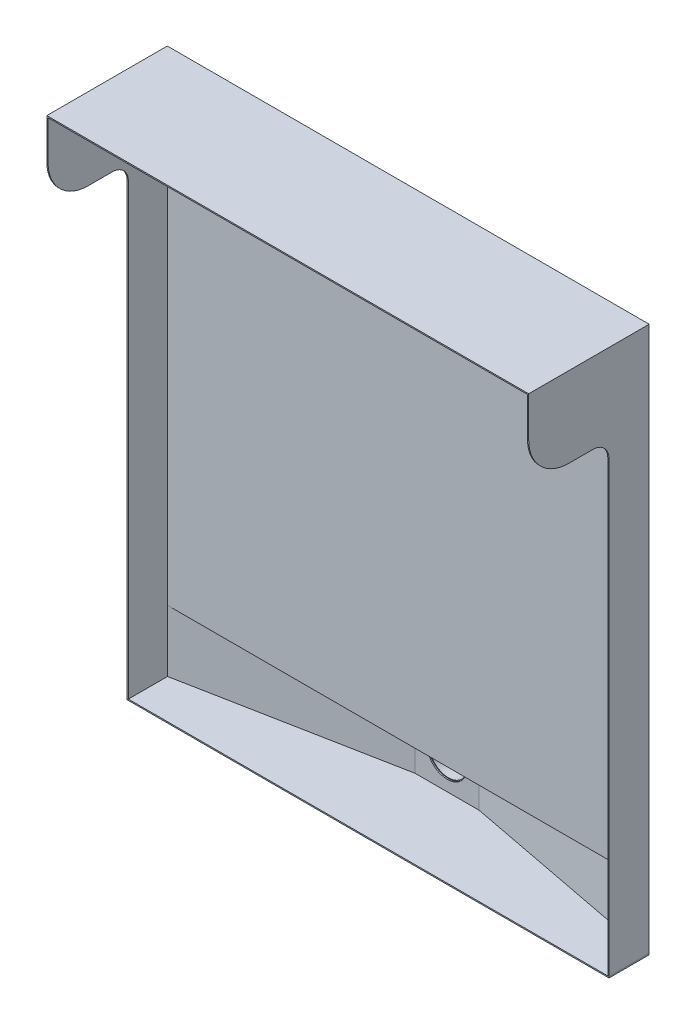
ISO-10303-21;
HEADER;
FILE_DESCRIPTION(('STEP AP214'),'2;1');
FILE_NAME('part.step','',(''),(''),'','','');
FILE_SCHEMA(('AUTOMOTIVE_DESIGN { 1 0 10303 214 1 1 1 1 }'));
ENDSEC;
DATA;
#1=APPLICATION_CONTEXT('core data for automotive mechanical design processes');
#2=APPLICATION_PROTOCOL_DEFINITION('international standard','automotive_design',2000,#1);
#3=PRODUCT_CONTEXT('',#1,'mechanical');
#4=PRODUCT('Part','Part','',(#3));
#5=PRODUCT_RELATED_PRODUCT_CATEGORY('part','',(#4));
#6=PRODUCT_DEFINITION_FORMATION('','',#4);
#7=PRODUCT_DEFINITION_CONTEXT('part definition',#1,'design');
#8=PRODUCT_DEFINITION('design','',#6,#7);
#9=PRODUCT_DEFINITION_SHAPE('','',#8);
#10=(LENGTH_UNIT() NAMED_UNIT(*) SI_UNIT(.MILLI.,.METRE.));
#11=(NAMED_UNIT(*) PLANE_ANGLE_UNIT() SI_UNIT($,.RADIAN.));
#12=(NAMED_UNIT(*) SI_UNIT($,.STERADIAN.) SOLID_ANGLE_UNIT());
#13=UNCERTAINTY_MEASURE_WITH_UNIT(LENGTH_MEASURE(1.E-05),#10,'distance_accuracy_value','');
#14=(GEOMETRIC_REPRESENTATION_CONTEXT(3) GLOBAL_UNCERTAINTY_ASSIGNED_CONTEXT((#13)) GLOBAL_UNIT_ASSIGNED_CONTEXT((#10,
#11,#12)) REPRESENTATION_CONTEXT('',''));
#15=CARTESIAN_POINT('',(0.,0.,0.));
#16=DIRECTION('',(0.,0.,1.));
#17=DIRECTION('',(1.,0.,0.));
#18=AXIS2_PLACEMENT_3D('',#15,#16,#17);
#19=CARTESIAN_POINT('',(0.,-300.,-75.));
#20=DIRECTION('',(0.,0.,-1.));
#21=DIRECTION('',(-1.,0.,0.));
#22=AXIS2_PLACEMENT_3D('',#19,#20,#21);
#23=PLANE('',#22);
#24=CARTESIAN_POINT('',(0.,-300.,-75.));
#25=DIRECTION('',(0.,0.,-1.));
#26=DIRECTION('',(-1.,0.,0.));
#27=AXIS2_PLACEMENT_3D('',#24,#25,#26);
#28=CIRCLE('',#27,25.);
#29=CARTESIAN_POINT('',(-25.,-300.,-75.));
#30=VERTEX_POINT('',#29);
#31=EDGE_CURVE('E12',#30,#30,#28,.T.);
#32=ORIENTED_EDGE('',*,*,#31,.T.);
#33=EDGE_LOOP('',(#32));
#34=FACE_BOUND('',#33,.T.);
#35=CARTESIAN_POINT('',(0.,-300.,-75.));
#36=DIRECTION('',(0.,0.,-1.));
#37=DIRECTION('',(-1.,0.,0.));
#38=AXIS2_PLACEMENT_3D('',#35,#36,#37);
#39=CIRCLE('',#38,24.);
#40=CARTESIAN_POINT('',(-24.,-300.,-75.));
#41=VERTEX_POINT('',#40);
#42=EDGE_CURVE('E73',#41,#41,#39,.T.);
#43=ORIENTED_EDGE('',*,*,#42,.F.);
#44=EDGE_LOOP('',(#43));
#45=FACE_BOUND('',#44,.T.);
#46=ADVANCED_FACE('F59',(#34,#45),#23,.T.);
#47=CARTESIAN_POINT('',(0.,-300.,-50.));
#48=DIRECTION('',(0.,0.,-1.));
#49=DIRECTION('',(-1.,0.,0.));
#50=AXIS2_PLACEMENT_3D('',#47,#48,#49);
#51=PLANE('',#50);
#52=CARTESIAN_POINT('',(0.,-300.,-50.));
#53=DIRECTION('',(0.,0.,-1.));
#54=DIRECTION('',(-1.,0.,0.));
#55=AXIS2_PLACEMENT_3D('',#52,#53,#54);
#56=CIRCLE('',#55,25.);
#57=CARTESIAN_POINT('',(-25.,-300.,-50.));
#58=VERTEX_POINT('',#57);
#59=EDGE_CURVE('E63',#58,#58,#56,.T.);
#60=ORIENTED_EDGE('',*,*,#59,.F.);
#61=EDGE_LOOP('',(#60));
#62=FACE_BOUND('',#61,.T.);
#63=CARTESIAN_POINT('',(0.,-300.,-50.));
#64=DIRECTION('',(0.,0.,-1.));
#65=DIRECTION('',(-1.,0.,0.));
#66=AXIS2_PLACEMENT_3D('',#63,#64,#65);
#67=CIRCLE('',#66,24.);
#68=CARTESIAN_POINT('',(-24.,-300.,-50.));
#69=VERTEX_POINT('',#68);
#70=EDGE_CURVE('E75',#69,#69,#67,.T.);
#71=ORIENTED_EDGE('',*,*,#70,.T.);
#72=EDGE_LOOP('',(#71));
#73=FACE_BOUND('',#72,.T.);
#74=ADVANCED_FACE('F86',(#62,#73),#51,.F.);
#75=CARTESIAN_POINT('',(0.,-300.,-75.));
#76=DIRECTION('',(0.,0.,1.));
#77=DIRECTION('',(1.,0.,0.));
#78=AXIS2_PLACEMENT_3D('',#75,#76,#77);
#79=CYLINDRICAL_SURFACE('',#78,25.);
#80=ORIENTED_EDGE('',*,*,#31,.F.);
#81=EDGE_LOOP('',(#80));
#82=FACE_BOUND('',#81,.T.);
#83=ORIENTED_EDGE('',*,*,#59,.T.);
#84=EDGE_LOOP('',(#83));
#85=FACE_BOUND('',#84,.T.);
#86=ADVANCED_FACE('F61',(#82,#85),#79,.T.);
#87=CARTESIAN_POINT('',(0.,-300.,-75.));
#88=DIRECTION('',(0.,0.,1.));
#89=DIRECTION('',(1.,0.,0.));
#90=AXIS2_PLACEMENT_3D('',#87,#88,#89);
#91=CYLINDRICAL_SURFACE('',#90,24.);
#92=ORIENTED_EDGE('',*,*,#42,.T.);
#93=EDGE_LOOP('',(#92));
#94=FACE_BOUND('',#93,.T.);
#95=ORIENTED_EDGE('',*,*,#70,.F.);
#96=EDGE_LOOP('',(#95));
#97=FACE_BOUND('',#96,.T.);
#98=ADVANCED_FACE('F82',(#94,#97),#91,.F.);
#99=CLOSED_SHELL('',(#46,#74,#86,#98));
#100=MANIFOLD_SOLID_BREP('B2',#99);
#101=CARTESIAN_POINT('',(-298.5,-338.5,150.));
#102=DIRECTION('',(0.,1.,0.));
#103=DIRECTION('',(-1.,0.,0.));
#104=AXIS2_PLACEMENT_3D('',#101,#102,#103);
#105=PLANE('',#104);
#106=DIRECTION('',(-1.,0.,0.));
#107=VECTOR('',#106,1.);
#108=CARTESIAN_POINT('',(-298.5,-338.5,50.0000000000001));
#109=LINE('',#108,#107);
#110=CARTESIAN_POINT('',(300.,-338.5,50.0000000000001));
#111=VERTEX_POINT('',#110);
#112=CARTESIAN_POINT('',(-300.,-338.5,50.0000000000001));
#113=VERTEX_POINT('',#112);
#114=EDGE_CURVE('E191',#111,#113,#109,.T.);
#115=ORIENTED_EDGE('',*,*,#114,.F.);
#116=DIRECTION('',(0.,0.,-1.));
#117=VECTOR('',#116,1.);
#118=CARTESIAN_POINT('',(300.,-338.5,150.));
#119=LINE('',#118,#117);
#120=CARTESIAN_POINT('',(300.,-338.5,0.));
#121=VERTEX_POINT('',#120);
#122=EDGE_CURVE('E199',#111,#121,#119,.T.);
#123=ORIENTED_EDGE('',*,*,#122,.T.);
#124=DIRECTION('',(0.982006446980647,0.,0.188847393650125));
#125=VECTOR('',#124,1.);
#126=CARTESIAN_POINT('',(40.0000000000001,-338.5,-50.));
#127=LINE('',#126,#125);
#128=CARTESIAN_POINT('',(40.0000000000001,-338.5,-50.));
#129=VERTEX_POINT('',#128);
#130=EDGE_CURVE('E251',#129,#121,#127,.T.);
#131=ORIENTED_EDGE('',*,*,#130,.F.);
#132=DIRECTION('',(1.,0.,0.));
#133=VECTOR('',#132,1.);
#134=CARTESIAN_POINT('',(40.0000000000001,-338.5,-50.));
#135=LINE('',#134,#133);
#136=CARTESIAN_POINT('',(-39.9999999999999,-338.5,-50.));
#137=VERTEX_POINT('',#136);
#138=EDGE_CURVE('E214',#137,#129,#135,.T.);
#139=ORIENTED_EDGE('',*,*,#138,.F.);
#140=DIRECTION('',(0.982006446980647,0.,-0.188847393650125));
#141=VECTOR('',#140,1.);
#142=CARTESIAN_POINT('',(-300.,-338.5,0.));
#143=LINE('',#142,#141);
#144=CARTESIAN_POINT('',(-300.,-338.5,0.));
#145=VERTEX_POINT('',#144);
#146=EDGE_CURVE('E212',#145,#137,#143,.T.);
#147=ORIENTED_EDGE('',*,*,#146,.F.);
#148=DIRECTION('',(0.,0.,1.));
#149=VECTOR('',#148,1.);
#150=CARTESIAN_POINT('',(-300.,-338.5,150.));
#151=LINE('',#150,#149);
#152=EDGE_CURVE('E206',#145,#113,#151,.T.);
#153=ORIENTED_EDGE('',*,*,#152,.T.);
#154=EDGE_LOOP('',(#115,#123,#131,#139,#147,#153));
#155=FACE_BOUND('',#154,.T.);
#156=ADVANCED_FACE('F138',(#155),#105,.T.);
#157=CARTESIAN_POINT('',(-300.,340.,150.));
#158=DIRECTION('',(1.,0.,0.));
#159=DIRECTION('',(0.,1.,0.));
#160=AXIS2_PLACEMENT_3D('',#157,#158,#159);
#161=PLANE('',#160);
#162=DIRECTION('',(0.,0.,-1.));
#163=VECTOR('',#162,1.);
#164=CARTESIAN_POINT('',(-300.,-340.,150.));
#165=LINE('',#164,#163);
#166=CARTESIAN_POINT('',(-300.,-340.,50.));
#167=VERTEX_POINT('',#166);
#168=CARTESIAN_POINT('',(-300.,-340.,0.));
#169=VERTEX_POINT('',#168);
#170=EDGE_CURVE('E208',#167,#169,#165,.T.);
#171=ORIENTED_EDGE('',*,*,#170,.F.);
#172=DIRECTION('',(0.,-1.,0.));
#173=VECTOR('',#172,1.);
#174=CARTESIAN_POINT('',(-300.,240.,50.));
#175=LINE('',#174,#173);
#176=EDGE_CURVE('E154',#113,#167,#175,.T.);
#177=ORIENTED_EDGE('',*,*,#176,.F.);
#178=ORIENTED_EDGE('',*,*,#152,.F.);
#179=DIRECTION('',(0.,-1.,0.));
#180=VECTOR('',#179,1.);
#181=CARTESIAN_POINT('',(-300.,-260.,0.));
#182=LINE('',#181,#180);
#183=EDGE_CURVE('E231',#145,#169,#182,.T.);
#184=ORIENTED_EDGE('',*,*,#183,.T.);
#185=EDGE_LOOP('',(#171,#177,#178,#184));
#186=FACE_BOUND('',#185,.T.);
#187=ADVANCED_FACE('F204',(#186),#161,.F.);
#188=CARTESIAN_POINT('',(300.,340.,150.));
#189=DIRECTION('',(-1.,0.,0.));
#190=DIRECTION('',(0.,-1.,0.));
#191=AXIS2_PLACEMENT_3D('',#188,#189,#190);
#192=PLANE('',#191);
#193=ORIENTED_EDGE('',*,*,#122,.F.);
#194=DIRECTION('',(0.,-1.,0.));
#195=VECTOR('',#194,1.);
#196=CARTESIAN_POINT('',(300.,240.,50.));
#197=LINE('',#196,#195);
#198=CARTESIAN_POINT('',(300.,-340.,50.0000000000001));
#199=VERTEX_POINT('',#198);
#200=EDGE_CURVE('E194',#111,#199,#197,.T.);
#201=ORIENTED_EDGE('',*,*,#200,.T.);
#202=DIRECTION('',(0.,0.,-1.));
#203=VECTOR('',#202,1.);
#204=CARTESIAN_POINT('',(300.,-340.,150.));
#205=LINE('',#204,#203);
#206=CARTESIAN_POINT('',(300.,-340.,0.));
#207=VERTEX_POINT('',#206);
#208=EDGE_CURVE('E228',#199,#207,#205,.T.);
#209=ORIENTED_EDGE('',*,*,#208,.T.);
#210=DIRECTION('',(0.,1.,0.));
#211=VECTOR('',#210,1.);
#212=CARTESIAN_POINT('',(300.,340.,0.));
#213=LINE('',#212,#211);
#214=EDGE_CURVE('E223',#207,#121,#213,.T.);
#215=ORIENTED_EDGE('',*,*,#214,.T.);
#216=EDGE_LOOP('',(#193,#201,#209,#215));
#217=FACE_BOUND('',#216,.T.);
#218=ADVANCED_FACE('F264',(#217),#192,.F.);
#219=CARTESIAN_POINT('',(40.0000000000001,-260.,-50.));
#220=DIRECTION('',(0.,0.,-1.));
#221=DIRECTION('',(-1.,0.,0.));
#222=AXIS2_PLACEMENT_3D('',#219,#220,#221);
#223=PLANE('',#222);
#224=DIRECTION('',(0.,-1.,0.));
#225=VECTOR('',#224,1.);
#226=CARTESIAN_POINT('',(-39.9999999999999,-260.,-50.));
#227=LINE('',#226,#225);
#228=CARTESIAN_POINT('',(-39.9999999999999,-340.,-50.));
#229=VERTEX_POINT('',#228);
#230=EDGE_CURVE('E227',#137,#229,#227,.T.);
#231=ORIENTED_EDGE('',*,*,#230,.F.);
#232=ORIENTED_EDGE('',*,*,#138,.T.);
#233=DIRECTION('',(0.,-1.,0.));
#234=VECTOR('',#233,1.);
#235=CARTESIAN_POINT('',(40.0000000000001,-260.,-50.));
#236=LINE('',#235,#234);
#237=CARTESIAN_POINT('',(40.0000000000001,-340.,-50.));
#238=VERTEX_POINT('',#237);
#239=EDGE_CURVE('E161',#129,#238,#236,.T.);
#240=ORIENTED_EDGE('',*,*,#239,.T.);
#241=DIRECTION('',(1.,0.,0.));
#242=VECTOR('',#241,1.);
#243=CARTESIAN_POINT('',(40.0000000000001,-340.,-50.));
#244=LINE('',#243,#242);
#245=EDGE_CURVE('E147',#229,#238,#244,.T.);
#246=ORIENTED_EDGE('',*,*,#245,.F.);
#247=EDGE_LOOP('',(#231,#232,#240,#246));
#248=FACE_BOUND('',#247,.T.);
#249=ADVANCED_FACE('F257',(#248),#223,.T.);
#250=CARTESIAN_POINT('',(-300.,-260.,0.));
#251=DIRECTION('',(-0.188847393650125,0.,-0.982006446980647));
#252=DIRECTION('',(-0.982006446980647,0.,0.188847393650125));
#253=AXIS2_PLACEMENT_3D('',#250,#251,#252);
#254=PLANE('',#253);
#255=ORIENTED_EDGE('',*,*,#183,.F.);
#256=ORIENTED_EDGE('',*,*,#146,.T.);
#257=ORIENTED_EDGE('',*,*,#230,.T.);
#258=DIRECTION('',(0.982006446980647,0.,-0.188847393650125));
#259=VECTOR('',#258,1.);
#260=CARTESIAN_POINT('',(-300.,-340.,0.));
#261=LINE('',#260,#259);
#262=EDGE_CURVE('E233',#169,#229,#261,.T.);
#263=ORIENTED_EDGE('',*,*,#262,.F.);
#264=EDGE_LOOP('',(#255,#256,#257,#263));
#265=FACE_BOUND('',#264,.T.);
#266=ADVANCED_FACE('F140',(#265),#254,.T.);
#267=CARTESIAN_POINT('',(40.0000000000001,-260.,-50.));
#268=DIRECTION('',(0.188847393650125,0.,-0.982006446980647));
#269=DIRECTION('',(-0.982006446980647,0.,-0.188847393650125));
#270=AXIS2_PLACEMENT_3D('',#267,#268,#269);
#271=PLANE('',#270);
#272=ORIENTED_EDGE('',*,*,#239,.F.);
#273=ORIENTED_EDGE('',*,*,#130,.T.);
#274=ORIENTED_EDGE('',*,*,#214,.F.);
#275=DIRECTION('',(0.982006446980647,0.,0.188847393650125));
#276=VECTOR('',#275,1.);
#277=CARTESIAN_POINT('',(40.0000000000001,-340.,-50.));
#278=LINE('',#277,#276);
#279=EDGE_CURVE('E237',#238,#207,#278,.T.);
#280=ORIENTED_EDGE('',*,*,#279,.F.);
#281=EDGE_LOOP('',(#272,#273,#274,#280));
#282=FACE_BOUND('',#281,.T.);
#283=ADVANCED_FACE('F262',(#282),#271,.T.);
#284=CARTESIAN_POINT('',(300.,-340.,150.));
#285=DIRECTION('',(0.,1.,0.));
#286=DIRECTION('',(-1.,0.,0.));
#287=AXIS2_PLACEMENT_3D('',#284,#285,#286);
#288=PLANE('',#287);
#289=ORIENTED_EDGE('',*,*,#208,.F.);
#290=DIRECTION('',(-1.,0.,0.));
#291=VECTOR('',#290,1.);
#292=CARTESIAN_POINT('',(300.,-340.,50.0000000000001));
#293=LINE('',#292,#291);
#294=EDGE_CURVE('E57',#199,#167,#293,.T.);
#295=ORIENTED_EDGE('',*,*,#294,.T.);
#296=ORIENTED_EDGE('',*,*,#170,.T.);
#297=ORIENTED_EDGE('',*,*,#262,.T.);
#298=ORIENTED_EDGE('',*,*,#245,.T.);
#299=ORIENTED_EDGE('',*,*,#279,.T.);
#300=EDGE_LOOP('',(#289,#295,#296,#297,#298,#299));
#301=FACE_BOUND('',#300,.T.);
#302=ADVANCED_FACE('F259',(#301),#288,.F.);
#303=CARTESIAN_POINT('',(300.,240.,50.));
#304=DIRECTION('',(0.,0.,-1.));
#305=DIRECTION('',(0.,1.,0.));
#306=AXIS2_PLACEMENT_3D('',#303,#304,#305);
#307=PLANE('',#306);
#308=ORIENTED_EDGE('',*,*,#114,.T.);
#309=ORIENTED_EDGE('',*,*,#176,.T.);
#310=ORIENTED_EDGE('',*,*,#294,.F.);
#311=ORIENTED_EDGE('',*,*,#200,.F.);
#312=EDGE_LOOP('',(#308,#309,#310,#311));
#313=FACE_BOUND('',#312,.T.);
#314=ADVANCED_FACE('F192',(#313),#307,.F.);
#315=CLOSED_SHELL('',(#156,#187,#218,#249,#266,#283,#302,#314));
#316=MANIFOLD_SOLID_BREP('B7',#315);
#317=CARTESIAN_POINT('',(0.,0.,150.));
#318=DIRECTION('',(0.,0.,-1.));
#319=DIRECTION('',(-1.,0.,0.));
#320=AXIS2_PLACEMENT_3D('',#317,#318,#319);
#321=PLANE('',#320);
#322=DIRECTION('',(0.,1.,0.));
#323=VECTOR('',#322,1.);
#324=CARTESIAN_POINT('',(298.5,0.,150.));
#325=LINE('',#324,#323);
#326=CARTESIAN_POINT('',(298.5,290.,150.));
#327=VERTEX_POINT('',#326);
#328=CARTESIAN_POINT('',(298.5,338.5,150.));
#329=VERTEX_POINT('',#328);
#330=EDGE_CURVE('E718',#327,#329,#325,.T.);
#331=ORIENTED_EDGE('',*,*,#330,.F.);
#332=DIRECTION('',(-1.,0.,0.));
#333=VECTOR('',#332,1.);
#334=CARTESIAN_POINT('',(300.,290.,150.));
#335=LINE('',#334,#333);
#336=CARTESIAN_POINT('',(300.,290.,150.));
#337=VERTEX_POINT('',#336);
#338=EDGE_CURVE('E591',#327,#337,#335,.F.);
#339=ORIENTED_EDGE('',*,*,#338,.T.);
#340=DIRECTION('',(0.,1.,0.));
#341=VECTOR('',#340,1.);
#342=CARTESIAN_POINT('',(300.,340.,150.));
#343=LINE('',#342,#341);
#344=CARTESIAN_POINT('',(300.,340.,150.));
#345=VERTEX_POINT('',#344);
#346=EDGE_CURVE('E613',#337,#345,#343,.T.);
#347=ORIENTED_EDGE('',*,*,#346,.T.);
#348=DIRECTION('',(-1.,0.,0.));
#349=VECTOR('',#348,1.);
#350=CARTESIAN_POINT('',(300.,340.,150.));
#351=LINE('',#350,#349);
#352=CARTESIAN_POINT('',(-300.,340.,150.));
#353=VERTEX_POINT('',#352);
#354=EDGE_CURVE('E610',#345,#353,#351,.T.);
#355=ORIENTED_EDGE('',*,*,#354,.T.);
#356=DIRECTION('',(0.,-1.,0.));
#357=VECTOR('',#356,1.);
#358=CARTESIAN_POINT('',(-300.,340.,150.));
#359=LINE('',#358,#357);
#360=CARTESIAN_POINT('',(-300.,290.,150.));
#361=VERTEX_POINT('',#360);
#362=EDGE_CURVE('E604',#353,#361,#359,.T.);
#363=ORIENTED_EDGE('',*,*,#362,.T.);
#364=DIRECTION('',(-1.,0.,0.));
#365=VECTOR('',#364,1.);
#366=CARTESIAN_POINT('',(-298.5,290.,150.));
#367=LINE('',#366,#365);
#368=CARTESIAN_POINT('',(-298.5,290.,150.));
#369=VERTEX_POINT('',#368);
#370=EDGE_CURVE('E588',#361,#369,#367,.F.);
#371=ORIENTED_EDGE('',*,*,#370,.T.);
#372=DIRECTION('',(0.,-1.,0.));
#373=VECTOR('',#372,1.);
#374=CARTESIAN_POINT('',(-298.5,0.,150.));
#375=LINE('',#374,#373);
#376=CARTESIAN_POINT('',(-298.5,338.5,150.));
#377=VERTEX_POINT('',#376);
#378=EDGE_CURVE('E659',#377,#369,#375,.T.);
#379=ORIENTED_EDGE('',*,*,#378,.F.);
#380=DIRECTION('',(-1.,0.,0.));
#381=VECTOR('',#380,1.);
#382=CARTESIAN_POINT('',(0.,338.5,150.));
#383=LINE('',#382,#381);
#384=EDGE_CURVE('E673',#329,#377,#383,.T.);
#385=ORIENTED_EDGE('',*,*,#384,.F.);
#386=EDGE_LOOP('',(#331,#339,#347,#355,#363,#371,#379,#385));
#387=FACE_BOUND('',#386,.T.);
#388=ADVANCED_FACE('F352',(#387),#321,.F.);
#389=CARTESIAN_POINT('',(-298.5,-338.5,150.));
#390=DIRECTION('',(0.,1.,0.));
#391=DIRECTION('',(-1.,0.,0.));
#392=AXIS2_PLACEMENT_3D('',#389,#390,#391);
#393=PLANE('',#392);
#394=DIRECTION('',(0.,0.,-1.));
#395=VECTOR('',#394,1.);
#396=CARTESIAN_POINT('',(300.,-338.5,150.));
#397=LINE('',#396,#395);
#398=CARTESIAN_POINT('',(300.,-338.5,50.0000000000001));
#399=VERTEX_POINT('',#398);
#400=CARTESIAN_POINT('',(300.,-338.5,0.));
#401=VERTEX_POINT('',#400);
#402=EDGE_CURVE('E543',#399,#401,#397,.T.);
#403=ORIENTED_EDGE('',*,*,#402,.F.);
#404=DIRECTION('',(-1.,0.,0.));
#405=VECTOR('',#404,1.);
#406=CARTESIAN_POINT('',(-298.5,-338.5,50.0000000000001));
#407=LINE('',#406,#405);
#408=CARTESIAN_POINT('',(298.5,-338.5,50.0000000000001));
#409=VERTEX_POINT('',#408);
#410=EDGE_CURVE('E535',#399,#409,#407,.T.);
#411=ORIENTED_EDGE('',*,*,#410,.T.);
#412=DIRECTION('',(0.,0.,-1.));
#413=VECTOR('',#412,1.);
#414=CARTESIAN_POINT('',(298.5,-338.5,150.));
#415=LINE('',#414,#413);
#416=CARTESIAN_POINT('',(298.5,-338.5,1.2390233417162));
#417=VERTEX_POINT('',#416);
#418=EDGE_CURVE('E558',#409,#417,#415,.T.);
#419=ORIENTED_EDGE('',*,*,#418,.T.);
#420=DIRECTION('',(0.982006446980647,0.,0.188847393650125));
#421=VECTOR('',#420,1.);
#422=CARTESIAN_POINT('',(39.7167289095249,-338.5,-48.526990329529));
#423=LINE('',#422,#421);
#424=CARTESIAN_POINT('',(39.8570786230759,-338.5,-48.5));
#425=VERTEX_POINT('',#424);
#426=EDGE_CURVE('E678',#425,#417,#423,.T.);
#427=ORIENTED_EDGE('',*,*,#426,.F.);
#428=DIRECTION('',(1.,0.,0.));
#429=VECTOR('',#428,1.);
#430=CARTESIAN_POINT('',(40.0000000000001,-338.5,-48.5));
#431=LINE('',#430,#429);
#432=CARTESIAN_POINT('',(-39.8570786230757,-338.5,-48.5));
#433=VERTEX_POINT('',#432);
#434=EDGE_CURVE('E679',#433,#425,#431,.T.);
#435=ORIENTED_EDGE('',*,*,#434,.F.);
#436=DIRECTION('',(0.982006446980647,0.,-0.188847393650125));
#437=VECTOR('',#436,1.);
#438=CARTESIAN_POINT('',(-299.716728909525,-338.5,1.47300967047097));
#439=LINE('',#438,#437);
#440=CARTESIAN_POINT('',(-298.5,-338.5,1.23902334171621));
#441=VERTEX_POINT('',#440);
#442=EDGE_CURVE('E674',#441,#433,#439,.T.);
#443=ORIENTED_EDGE('',*,*,#442,.F.);
#444=DIRECTION('',(0.,0.,-1.));
#445=VECTOR('',#444,1.);
#446=CARTESIAN_POINT('',(-298.5,-338.5,150.));
#447=LINE('',#446,#445);
#448=CARTESIAN_POINT('',(-298.5,-338.5,50.0000000000001));
#449=VERTEX_POINT('',#448);
#450=EDGE_CURVE('E530',#449,#441,#447,.T.);
#451=ORIENTED_EDGE('',*,*,#450,.F.);
#452=CARTESIAN_POINT('',(-300.,-338.5,50.0000000000001));
#453=VERTEX_POINT('',#452);
#454=EDGE_CURVE('E511',#449,#453,#407,.T.);
#455=ORIENTED_EDGE('',*,*,#454,.T.);
#456=DIRECTION('',(0.,0.,1.));
#457=VECTOR('',#456,1.);
#458=CARTESIAN_POINT('',(-300.,-338.5,150.));
#459=LINE('',#458,#457);
#460=CARTESIAN_POINT('',(-300.,-338.5,0.));
#461=VERTEX_POINT('',#460);
#462=EDGE_CURVE('E527',#461,#453,#459,.T.);
#463=ORIENTED_EDGE('',*,*,#462,.F.);
#464=DIRECTION('',(0.982006446980647,0.,-0.188847393650125));
#465=VECTOR('',#464,1.);
#466=CARTESIAN_POINT('',(-300.,-338.5,0.));
#467=LINE('',#466,#465);
#468=CARTESIAN_POINT('',(-39.9999999999999,-338.5,-50.));
#469=VERTEX_POINT('',#468);
#470=EDGE_CURVE('E548',#461,#469,#467,.T.);
#471=ORIENTED_EDGE('',*,*,#470,.T.);
#472=DIRECTION('',(1.,0.,0.));
#473=VECTOR('',#472,1.);
#474=CARTESIAN_POINT('',(40.0000000000001,-338.5,-50.));
#475=LINE('',#474,#473);
#476=CARTESIAN_POINT('',(40.0000000000001,-338.5,-50.));
#477=VERTEX_POINT('',#476);
#478=EDGE_CURVE('E542',#469,#477,#475,.T.);
#479=ORIENTED_EDGE('',*,*,#478,.T.);
#480=DIRECTION('',(0.982006446980647,0.,0.188847393650125));
#481=VECTOR('',#480,1.);
#482=CARTESIAN_POINT('',(40.0000000000001,-338.5,-50.));
#483=LINE('',#482,#481);
#484=EDGE_CURVE('E687',#477,#401,#483,.T.);
#485=ORIENTED_EDGE('',*,*,#484,.T.);
#486=EDGE_LOOP('',(#403,#411,#419,#427,#435,#443,#451,#455,#463,#471,#479,#485));
#487=FACE_BOUND('',#486,.T.);
#488=ADVANCED_FACE('F525',(#487),#393,.F.);
#489=CARTESIAN_POINT('',(300.,340.,150.));
#490=DIRECTION('',(0.,-1.,0.));
#491=DIRECTION('',(1.,0.,0.));
#492=AXIS2_PLACEMENT_3D('',#489,#490,#491);
#493=PLANE('',#492);
#494=DIRECTION('',(-1.,0.,0.));
#495=VECTOR('',#494,1.);
#496=CARTESIAN_POINT('',(300.,340.,0.));
#497=LINE('',#496,#495);
#498=CARTESIAN_POINT('',(300.,340.,0.));
#499=VERTEX_POINT('',#498);
#500=CARTESIAN_POINT('',(-300.,340.,0.));
#501=VERTEX_POINT('',#500);
#502=EDGE_CURVE('E614',#499,#501,#497,.T.);
#503=ORIENTED_EDGE('',*,*,#502,.T.);
#504=DIRECTION('',(0.,0.,-1.));
#505=VECTOR('',#504,1.);
#506=CARTESIAN_POINT('',(-300.,340.,150.));
#507=LINE('',#506,#505);
#508=EDGE_CURVE('E751',#353,#501,#507,.T.);
#509=ORIENTED_EDGE('',*,*,#508,.F.);
#510=ORIENTED_EDGE('',*,*,#354,.F.);
#511=DIRECTION('',(0.,0.,-1.));
#512=VECTOR('',#511,1.);
#513=CARTESIAN_POINT('',(300.,340.,150.));
#514=LINE('',#513,#512);
#515=EDGE_CURVE('E551',#345,#499,#514,.T.);
#516=ORIENTED_EDGE('',*,*,#515,.T.);
#517=EDGE_LOOP('',(#503,#509,#510,#516));
#518=FACE_BOUND('',#517,.T.);
#519=ADVANCED_FACE('F859',(#518),#493,.F.);
#520=CARTESIAN_POINT('',(0.,0.,0.));
#521=DIRECTION('',(0.,0.,-1.));
#522=DIRECTION('',(-1.,0.,0.));
#523=AXIS2_PLACEMENT_3D('',#520,#521,#522);
#524=PLANE('',#523);
#525=DIRECTION('',(0.,1.,0.));
#526=VECTOR('',#525,1.);
#527=CARTESIAN_POINT('',(300.,340.,0.));
#528=LINE('',#527,#526);
#529=CARTESIAN_POINT('',(300.,-260.,0.));
#530=VERTEX_POINT('',#529);
#531=EDGE_CURVE('E754',#530,#499,#528,.T.);
#532=ORIENTED_EDGE('',*,*,#531,.F.);
#533=DIRECTION('',(-1.,0.,0.));
#534=VECTOR('',#533,1.);
#535=CARTESIAN_POINT('',(300.,-260.,0.));
#536=LINE('',#535,#534);
#537=CARTESIAN_POINT('',(-300.,-260.,0.));
#538=VERTEX_POINT('',#537);
#539=EDGE_CURVE('E730',#530,#538,#536,.T.);
#540=ORIENTED_EDGE('',*,*,#539,.T.);
#541=DIRECTION('',(0.,-1.,0.));
#542=VECTOR('',#541,1.);
#543=CARTESIAN_POINT('',(-300.,340.,0.));
#544=LINE('',#543,#542);
#545=EDGE_CURVE('E743',#501,#538,#544,.T.);
#546=ORIENTED_EDGE('',*,*,#545,.F.);
#547=ORIENTED_EDGE('',*,*,#502,.F.);
#548=EDGE_LOOP('',(#532,#540,#546,#547));
#549=FACE_BOUND('',#548,.T.);
#550=ADVANCED_FACE('F787',(#549),#524,.T.);
#551=CARTESIAN_POINT('',(0.,0.,1.5));
#552=DIRECTION('',(0.,0.,-1.));
#553=DIRECTION('',(-1.,0.,0.));
#554=AXIS2_PLACEMENT_3D('',#551,#552,#553);
#555=PLANE('',#554);
#556=DIRECTION('',(0.,1.,0.));
#557=VECTOR('',#556,1.);
#558=CARTESIAN_POINT('',(298.5,0.,1.5));
#559=LINE('',#558,#557);
#560=CARTESIAN_POINT('',(298.5,-261.5,1.5));
#561=VERTEX_POINT('',#560);
#562=CARTESIAN_POINT('',(298.5,338.5,1.5));
#563=VERTEX_POINT('',#562);
#564=EDGE_CURVE('E641',#561,#563,#559,.T.);
#565=ORIENTED_EDGE('',*,*,#564,.T.);
#566=DIRECTION('',(-1.,0.,0.));
#567=VECTOR('',#566,1.);
#568=CARTESIAN_POINT('',(0.,338.5,1.5));
#569=LINE('',#568,#567);
#570=CARTESIAN_POINT('',(-298.5,338.5,1.5));
#571=VERTEX_POINT('',#570);
#572=EDGE_CURVE('E656',#563,#571,#569,.T.);
#573=ORIENTED_EDGE('',*,*,#572,.T.);
#574=DIRECTION('',(0.,-1.,0.));
#575=VECTOR('',#574,1.);
#576=CARTESIAN_POINT('',(-298.5,0.,1.5));
#577=LINE('',#576,#575);
#578=CARTESIAN_POINT('',(-298.5,-261.5,1.5));
#579=VERTEX_POINT('',#578);
#580=EDGE_CURVE('E645',#571,#579,#577,.T.);
#581=ORIENTED_EDGE('',*,*,#580,.T.);
#582=DIRECTION('',(-1.,0.,0.));
#583=VECTOR('',#582,1.);
#584=CARTESIAN_POINT('',(0.,-261.5,1.5));
#585=LINE('',#584,#583);
#586=EDGE_CURVE('E646',#561,#579,#585,.T.);
#587=ORIENTED_EDGE('',*,*,#586,.F.);
#588=EDGE_LOOP('',(#565,#573,#581,#587));
#589=FACE_BOUND('',#588,.T.);
#590=ADVANCED_FACE('F825',(#589),#555,.F.);
#591=CARTESIAN_POINT('',(300.,338.5,150.));
#592=DIRECTION('',(0.,-1.,0.));
#593=DIRECTION('',(1.,0.,0.));
#594=AXIS2_PLACEMENT_3D('',#591,#592,#593);
#595=PLANE('',#594);
#596=ORIENTED_EDGE('',*,*,#572,.F.);
#597=DIRECTION('',(0.,0.,-1.));
#598=VECTOR('',#597,1.);
#599=CARTESIAN_POINT('',(298.5,338.5,150.));
#600=LINE('',#599,#598);
#601=EDGE_CURVE('E668',#329,#563,#600,.T.);
#602=ORIENTED_EDGE('',*,*,#601,.F.);
#603=ORIENTED_EDGE('',*,*,#384,.T.);
#604=DIRECTION('',(0.,0.,-1.));
#605=VECTOR('',#604,1.);
#606=CARTESIAN_POINT('',(-298.5,338.5,150.));
#607=LINE('',#606,#605);
#608=EDGE_CURVE('E669',#377,#571,#607,.T.);
#609=ORIENTED_EDGE('',*,*,#608,.T.);
#610=EDGE_LOOP('',(#596,#602,#603,#609));
#611=FACE_BOUND('',#610,.T.);
#612=ADVANCED_FACE('F819',(#611),#595,.T.);
#613=CARTESIAN_POINT('',(0.,-300.,150.));
#614=DIRECTION('',(0.,0.,-1.));
#615=DIRECTION('',(-1.,0.,0.));
#616=AXIS2_PLACEMENT_3D('',#613,#614,#615);
#617=CYLINDRICAL_SURFACE('',#616,25.);
#618=CARTESIAN_POINT('',(0.,-300.,-50.));
#619=DIRECTION('',(0.,0.,-1.));
#620=DIRECTION('',(-1.,0.,0.));
#621=AXIS2_PLACEMENT_3D('',#618,#619,#620);
#622=CIRCLE('',#621,25.);
#623=CARTESIAN_POINT('',(-25.,-300.,-50.));
#624=VERTEX_POINT('',#623);
#625=EDGE_CURVE('E532',#624,#624,#622,.T.);
#626=ORIENTED_EDGE('',*,*,#625,.T.);
#627=EDGE_LOOP('',(#626));
#628=FACE_BOUND('',#627,.T.);
#629=CARTESIAN_POINT('',(0.,-300.,-48.5));
#630=DIRECTION('',(0.,0.,-1.));
#631=DIRECTION('',(-1.,0.,0.));
#632=AXIS2_PLACEMENT_3D('',#629,#630,#631);
#633=CIRCLE('',#632,25.);
#634=CARTESIAN_POINT('',(-25.,-300.,-48.5));
#635=VERTEX_POINT('',#634);
#636=EDGE_CURVE('E640',#635,#635,#633,.T.);
#637=ORIENTED_EDGE('',*,*,#636,.F.);
#638=EDGE_LOOP('',(#637));
#639=FACE_BOUND('',#638,.T.);
#640=ADVANCED_FACE('F952',(#628,#639),#617,.F.);
#641=CARTESIAN_POINT('',(-298.5,340.,150.));
#642=DIRECTION('',(1.,0.,0.));
#643=DIRECTION('',(0.,1.,0.));
#644=AXIS2_PLACEMENT_3D('',#641,#642,#643);
#645=PLANE('',#644);
#646=ORIENTED_EDGE('',*,*,#378,.T.);
#647=CARTESIAN_POINT('',(-298.5,290.,100.));
#648=DIRECTION('',(1.,0.,0.));
#649=DIRECTION('',(0.,1.,0.));
#650=AXIS2_PLACEMENT_3D('',#647,#648,#649);
#651=CIRCLE('',#650,50.);
#652=CARTESIAN_POINT('',(-298.5,240.,100.));
#653=VERTEX_POINT('',#652);
#654=EDGE_CURVE('E136',#369,#653,#651,.T.);
#655=ORIENTED_EDGE('',*,*,#654,.T.);
#656=DIRECTION('',(0.,0.,-1.));
#657=VECTOR('',#656,1.);
#658=CARTESIAN_POINT('',(-298.5,240.,150.));
#659=LINE('',#658,#657);
#660=CARTESIAN_POINT('',(-298.5,240.,70.));
#661=VERTEX_POINT('',#660);
#662=EDGE_CURVE('E619',#653,#661,#659,.T.);
#663=ORIENTED_EDGE('',*,*,#662,.T.);
#664=CARTESIAN_POINT('',(-298.5,220.,70.));
#665=DIRECTION('',(1.,0.,0.));
#666=DIRECTION('',(0.,1.,0.));
#667=AXIS2_PLACEMENT_3D('',#664,#665,#666);
#668=CIRCLE('',#667,20.);
#669=CARTESIAN_POINT('',(-298.5,220.,50.));
#670=VERTEX_POINT('',#669);
#671=EDGE_CURVE('E572',#661,#670,#668,.F.);
#672=ORIENTED_EDGE('',*,*,#671,.T.);
#673=DIRECTION('',(0.,1.,0.));
#674=VECTOR('',#673,1.);
#675=CARTESIAN_POINT('',(-298.5,340.,50.));
#676=LINE('',#675,#674);
#677=EDGE_CURVE('E533',#449,#670,#676,.T.);
#678=ORIENTED_EDGE('',*,*,#677,.F.);
#679=ORIENTED_EDGE('',*,*,#450,.T.);
#680=DIRECTION('',(0.,-1.,0.));
#681=VECTOR('',#680,1.);
#682=CARTESIAN_POINT('',(-298.5,-260.,1.23902334171621));
#683=LINE('',#682,#681);
#684=CARTESIAN_POINT('',(-298.5,-261.5,1.23902334171619));
#685=VERTEX_POINT('',#684);
#686=EDGE_CURVE('E660',#685,#441,#683,.T.);
#687=ORIENTED_EDGE('',*,*,#686,.F.);
#688=DIRECTION('',(0.,0.,-1.));
#689=VECTOR('',#688,1.);
#690=CARTESIAN_POINT('',(-298.5,-261.5,149.999999999999));
#691=LINE('',#690,#689);
#692=EDGE_CURVE('E711',#579,#685,#691,.T.);
#693=ORIENTED_EDGE('',*,*,#692,.F.);
#694=ORIENTED_EDGE('',*,*,#580,.F.);
#695=ORIENTED_EDGE('',*,*,#608,.F.);
#696=EDGE_LOOP('',(#646,#655,#663,#672,#678,#679,#687,#693,#694,#695));
#697=FACE_BOUND('',#696,.T.);
#698=ADVANCED_FACE('F821',(#697),#645,.T.);
#699=CARTESIAN_POINT('',(40.0000000000001,-260.,-48.5));
#700=DIRECTION('',(0.,0.,-1.));
#701=DIRECTION('',(-1.,0.,0.));
#702=AXIS2_PLACEMENT_3D('',#699,#700,#701);
#703=PLANE('',#702);
#704=ORIENTED_EDGE('',*,*,#636,.T.);
#705=EDGE_LOOP('',(#704));
#706=FACE_BOUND('',#705,.T.);
#707=ORIENTED_EDGE('',*,*,#434,.T.);
#708=DIRECTION('',(0.,-1.,0.));
#709=VECTOR('',#708,1.);
#710=CARTESIAN_POINT('',(39.8570786230758,-260.,-48.5));
#711=LINE('',#710,#709);
#712=CARTESIAN_POINT('',(39.8570786230758,-261.5,-48.5));
#713=VERTEX_POINT('',#712);
#714=EDGE_CURVE('E664',#713,#425,#711,.T.);
#715=ORIENTED_EDGE('',*,*,#714,.F.);
#716=DIRECTION('',(1.,0.,0.));
#717=VECTOR('',#716,1.);
#718=CARTESIAN_POINT('',(0.,-261.5,-48.5));
#719=LINE('',#718,#717);
#720=CARTESIAN_POINT('',(-39.8570786230757,-261.5,-48.5));
#721=VERTEX_POINT('',#720);
#722=EDGE_CURVE('E677',#721,#713,#719,.T.);
#723=ORIENTED_EDGE('',*,*,#722,.F.);
#724=DIRECTION('',(0.,-1.,0.));
#725=VECTOR('',#724,1.);
#726=CARTESIAN_POINT('',(-39.8570786230757,-260.,-48.5));
#727=LINE('',#726,#725);
#728=EDGE_CURVE('E655',#721,#433,#727,.T.);
#729=ORIENTED_EDGE('',*,*,#728,.T.);
#730=EDGE_LOOP('',(#707,#715,#723,#729));
#731=FACE_BOUND('',#730,.T.);
#732=ADVANCED_FACE('F939',(#706,#731),#703,.F.);
#733=CARTESIAN_POINT('',(0.,-261.5,-3.79141162909491E-13));
#734=DIRECTION('',(0.,-1.,0.));
#735=DIRECTION('',(0.,0.,-1.));
#736=AXIS2_PLACEMENT_3D('',#733,#734,#735);
#737=PLANE('',#736);
#738=ORIENTED_EDGE('',*,*,#722,.T.);
#739=DIRECTION('',(0.982006446980647,0.,0.188847393650125));
#740=VECTOR('',#739,1.);
#741=CARTESIAN_POINT('',(10.4157303360583,-261.5,-54.1617977475034));
#742=LINE('',#741,#740);
#743=CARTESIAN_POINT('',(298.5,-261.5,1.2390233417162));
#744=VERTEX_POINT('',#743);
#745=EDGE_CURVE('E651',#713,#744,#742,.T.);
#746=ORIENTED_EDGE('',*,*,#745,.T.);
#747=DIRECTION('',(0.,0.,-1.));
#748=VECTOR('',#747,1.);
#749=CARTESIAN_POINT('',(298.5,-261.5,-3.79141162909491E-13));
#750=LINE('',#749,#748);
#751=EDGE_CURVE('E667',#561,#744,#750,.T.);
#752=ORIENTED_EDGE('',*,*,#751,.F.);
#753=ORIENTED_EDGE('',*,*,#586,.T.);
#754=ORIENTED_EDGE('',*,*,#692,.T.);
#755=DIRECTION('',(0.982006446980647,0.,-0.188847393650125));
#756=VECTOR('',#755,1.);
#757=CARTESIAN_POINT('',(-10.4157303360583,-261.5,-54.1617977475034));
#758=LINE('',#757,#756);
#759=EDGE_CURVE('E650',#685,#721,#758,.T.);
#760=ORIENTED_EDGE('',*,*,#759,.T.);
#761=EDGE_LOOP('',(#738,#746,#752,#753,#754,#760));
#762=FACE_BOUND('',#761,.T.);
#763=ADVANCED_FACE('F830',(#762),#737,.T.);
#764=CARTESIAN_POINT('',(298.5,340.,150.));
#765=DIRECTION('',(-1.,0.,0.));
#766=DIRECTION('',(0.,-1.,0.));
#767=AXIS2_PLACEMENT_3D('',#764,#765,#766);
#768=PLANE('',#767);
#769=DIRECTION('',(0.,0.,1.));
#770=VECTOR('',#769,1.);
#771=CARTESIAN_POINT('',(298.5,240.,150.));
#772=LINE('',#771,#770);
#773=CARTESIAN_POINT('',(298.5,240.,70.));
#774=VERTEX_POINT('',#773);
#775=CARTESIAN_POINT('',(298.5,240.,100.));
#776=VERTEX_POINT('',#775);
#777=EDGE_CURVE('E623',#774,#776,#772,.T.);
#778=ORIENTED_EDGE('',*,*,#777,.T.);
#779=CARTESIAN_POINT('',(298.5,290.,100.));
#780=DIRECTION('',(-1.,0.,0.));
#781=DIRECTION('',(0.,-1.,0.));
#782=AXIS2_PLACEMENT_3D('',#779,#780,#781);
#783=CIRCLE('',#782,50.);
#784=EDGE_CURVE('E585',#776,#327,#783,.T.);
#785=ORIENTED_EDGE('',*,*,#784,.T.);
#786=ORIENTED_EDGE('',*,*,#330,.T.);
#787=ORIENTED_EDGE('',*,*,#601,.T.);
#788=ORIENTED_EDGE('',*,*,#564,.F.);
#789=ORIENTED_EDGE('',*,*,#751,.T.);
#790=DIRECTION('',(0.,1.,0.));
#791=VECTOR('',#790,1.);
#792=CARTESIAN_POINT('',(298.5,-260.,1.2390233417162));
#793=LINE('',#792,#791);
#794=EDGE_CURVE('E644',#417,#744,#793,.T.);
#795=ORIENTED_EDGE('',*,*,#794,.F.);
#796=ORIENTED_EDGE('',*,*,#418,.F.);
#797=DIRECTION('',(0.,-1.,0.));
#798=VECTOR('',#797,1.);
#799=CARTESIAN_POINT('',(298.5,340.,50.));
#800=LINE('',#799,#798);
#801=CARTESIAN_POINT('',(298.5,220.,50.));
#802=VERTEX_POINT('',#801);
#803=EDGE_CURVE('E622',#802,#409,#800,.T.);
#804=ORIENTED_EDGE('',*,*,#803,.F.);
#805=CARTESIAN_POINT('',(298.5,220.,70.));
#806=DIRECTION('',(-1.,0.,0.));
#807=DIRECTION('',(0.,-1.,0.));
#808=AXIS2_PLACEMENT_3D('',#805,#806,#807);
#809=CIRCLE('',#808,20.);
#810=EDGE_CURVE('E575',#802,#774,#809,.F.);
#811=ORIENTED_EDGE('',*,*,#810,.T.);
#812=EDGE_LOOP('',(#778,#785,#786,#787,#788,#789,#795,#796,#804,#811));
#813=FACE_BOUND('',#812,.T.);
#814=ADVANCED_FACE('F812',(#813),#768,.T.);
#815=CARTESIAN_POINT('',(39.7167289095249,-260.,-48.526990329529));
#816=DIRECTION('',(0.188847393650125,0.,-0.982006446980647));
#817=DIRECTION('',(-0.982006446980647,0.,-0.188847393650125));
#818=AXIS2_PLACEMENT_3D('',#815,#816,#817);
#819=PLANE('',#818);
#820=ORIENTED_EDGE('',*,*,#426,.T.);
#821=ORIENTED_EDGE('',*,*,#794,.T.);
#822=ORIENTED_EDGE('',*,*,#745,.F.);
#823=ORIENTED_EDGE('',*,*,#714,.T.);
#824=EDGE_LOOP('',(#820,#821,#822,#823));
#825=FACE_BOUND('',#824,.T.);
#826=ADVANCED_FACE('F834',(#825),#819,.F.);
#827=CARTESIAN_POINT('',(-299.716728909525,-260.,1.47300967047097));
#828=DIRECTION('',(-0.188847393650125,0.,-0.982006446980647));
#829=DIRECTION('',(-0.982006446980647,0.,0.188847393650125));
#830=AXIS2_PLACEMENT_3D('',#827,#828,#829);
#831=PLANE('',#830);
#832=ORIENTED_EDGE('',*,*,#442,.T.);
#833=ORIENTED_EDGE('',*,*,#728,.F.);
#834=ORIENTED_EDGE('',*,*,#759,.F.);
#835=ORIENTED_EDGE('',*,*,#686,.T.);
#836=EDGE_LOOP('',(#832,#833,#834,#835));
#837=FACE_BOUND('',#836,.T.);
#838=ADVANCED_FACE('F845',(#837),#831,.F.);
#839=CARTESIAN_POINT('',(300.,340.,150.));
#840=DIRECTION('',(-1.,0.,0.));
#841=DIRECTION('',(0.,-1.,0.));
#842=AXIS2_PLACEMENT_3D('',#839,#840,#841);
#843=PLANE('',#842);
#844=ORIENTED_EDGE('',*,*,#346,.F.);
#845=CARTESIAN_POINT('',(300.,290.,100.));
#846=DIRECTION('',(-1.,0.,0.));
#847=DIRECTION('',(0.,-1.,0.));
#848=AXIS2_PLACEMENT_3D('',#845,#846,#847);
#849=CIRCLE('',#848,50.);
#850=CARTESIAN_POINT('',(300.,240.,100.));
#851=VERTEX_POINT('',#850);
#852=EDGE_CURVE('E594',#337,#851,#849,.F.);
#853=ORIENTED_EDGE('',*,*,#852,.T.);
#854=DIRECTION('',(0.,0.,1.));
#855=VECTOR('',#854,1.);
#856=CARTESIAN_POINT('',(300.,240.,50.));
#857=LINE('',#856,#855);
#858=CARTESIAN_POINT('',(300.,240.,70.));
#859=VERTEX_POINT('',#858);
#860=EDGE_CURVE('E518',#859,#851,#857,.T.);
#861=ORIENTED_EDGE('',*,*,#860,.F.);
#862=CARTESIAN_POINT('',(300.,220.,70.));
#863=DIRECTION('',(-1.,0.,0.));
#864=DIRECTION('',(0.,-1.,0.));
#865=AXIS2_PLACEMENT_3D('',#862,#863,#864);
#866=CIRCLE('',#865,20.);
#867=CARTESIAN_POINT('',(300.,220.,50.));
#868=VERTEX_POINT('',#867);
#869=EDGE_CURVE('E578',#859,#868,#866,.T.);
#870=ORIENTED_EDGE('',*,*,#869,.T.);
#871=DIRECTION('',(0.,-1.,0.));
#872=VECTOR('',#871,1.);
#873=CARTESIAN_POINT('',(300.,240.,50.));
#874=LINE('',#873,#872);
#875=EDGE_CURVE('E630',#868,#399,#874,.T.);
#876=ORIENTED_EDGE('',*,*,#875,.T.);
#877=ORIENTED_EDGE('',*,*,#402,.T.);
#878=EDGE_CURVE('E755',#401,#530,#528,.T.);
#879=ORIENTED_EDGE('',*,*,#878,.T.);
#880=ORIENTED_EDGE('',*,*,#531,.T.);
#881=ORIENTED_EDGE('',*,*,#515,.F.);
#882=EDGE_LOOP('',(#844,#853,#861,#870,#876,#877,#879,#880,#881));
#883=FACE_BOUND('',#882,.T.);
#884=ADVANCED_FACE('F843',(#883),#843,.F.);
#885=CARTESIAN_POINT('',(0.,-260.,-3.77475828372553E-13));
#886=DIRECTION('',(0.,-1.,0.));
#887=DIRECTION('',(0.,0.,-1.));
#888=AXIS2_PLACEMENT_3D('',#885,#886,#887);
#889=PLANE('',#888);
#890=DIRECTION('',(1.,0.,0.));
#891=VECTOR('',#890,1.);
#892=CARTESIAN_POINT('',(40.0000000000001,-260.,-50.));
#893=LINE('',#892,#891);
#894=CARTESIAN_POINT('',(-39.9999999999999,-260.,-50.));
#895=VERTEX_POINT('',#894);
#896=CARTESIAN_POINT('',(40.0000000000001,-260.,-50.));
#897=VERTEX_POINT('',#896);
#898=EDGE_CURVE('E715',#895,#897,#893,.T.);
#899=ORIENTED_EDGE('',*,*,#898,.F.);
#900=DIRECTION('',(0.982006446980647,0.,-0.188847393650125));
#901=VECTOR('',#900,1.);
#902=CARTESIAN_POINT('',(-300.,-260.,0.));
#903=LINE('',#902,#901);
#904=EDGE_CURVE('E734',#538,#895,#903,.T.);
#905=ORIENTED_EDGE('',*,*,#904,.F.);
#906=ORIENTED_EDGE('',*,*,#539,.F.);
#907=DIRECTION('',(0.982006446980647,0.,0.188847393650125));
#908=VECTOR('',#907,1.);
#909=CARTESIAN_POINT('',(40.0000000000001,-260.,-50.));
#910=LINE('',#909,#908);
#911=EDGE_CURVE('E726',#897,#530,#910,.T.);
#912=ORIENTED_EDGE('',*,*,#911,.F.);
#913=EDGE_LOOP('',(#899,#905,#906,#912));
#914=FACE_BOUND('',#913,.T.);
#915=ADVANCED_FACE('F780',(#914),#889,.F.);
#916=CARTESIAN_POINT('',(40.0000000000001,-260.,-50.));
#917=DIRECTION('',(0.,0.,-1.));
#918=DIRECTION('',(-1.,0.,0.));
#919=AXIS2_PLACEMENT_3D('',#916,#917,#918);
#920=PLANE('',#919);
#921=ORIENTED_EDGE('',*,*,#478,.F.);
#922=DIRECTION('',(0.,-1.,0.));
#923=VECTOR('',#922,1.);
#924=CARTESIAN_POINT('',(-39.9999999999999,-260.,-50.));
#925=LINE('',#924,#923);
#926=EDGE_CURVE('E739',#895,#469,#925,.T.);
#927=ORIENTED_EDGE('',*,*,#926,.F.);
#928=ORIENTED_EDGE('',*,*,#898,.T.);
#929=DIRECTION('',(0.,-1.,0.));
#930=VECTOR('',#929,1.);
#931=CARTESIAN_POINT('',(40.0000000000001,-260.,-50.));
#932=LINE('',#931,#930);
#933=EDGE_CURVE('E738',#897,#477,#932,.T.);
#934=ORIENTED_EDGE('',*,*,#933,.T.);
#935=EDGE_LOOP('',(#921,#927,#928,#934));
#936=FACE_BOUND('',#935,.T.);
#937=ORIENTED_EDGE('',*,*,#625,.F.);
#938=EDGE_LOOP('',(#937));
#939=FACE_BOUND('',#938,.T.);
#940=ADVANCED_FACE('F776',(#936,#939),#920,.T.);
#941=CARTESIAN_POINT('',(40.0000000000001,-260.,-50.));
#942=DIRECTION('',(0.188847393650125,0.,-0.982006446980647));
#943=DIRECTION('',(-0.982006446980647,0.,-0.188847393650125));
#944=AXIS2_PLACEMENT_3D('',#941,#942,#943);
#945=PLANE('',#944);
#946=ORIENTED_EDGE('',*,*,#484,.F.);
#947=ORIENTED_EDGE('',*,*,#933,.F.);
#948=ORIENTED_EDGE('',*,*,#911,.T.);
#949=ORIENTED_EDGE('',*,*,#878,.F.);
#950=EDGE_LOOP('',(#946,#947,#948,#949));
#951=FACE_BOUND('',#950,.T.);
#952=ADVANCED_FACE('F784',(#951),#945,.T.);
#953=CARTESIAN_POINT('',(-300.,340.,150.));
#954=DIRECTION('',(1.,0.,0.));
#955=DIRECTION('',(0.,1.,0.));
#956=AXIS2_PLACEMENT_3D('',#953,#954,#955);
#957=PLANE('',#956);
#958=DIRECTION('',(0.,0.,1.));
#959=VECTOR('',#958,1.);
#960=CARTESIAN_POINT('',(-300.,240.,50.));
#961=LINE('',#960,#959);
#962=CARTESIAN_POINT('',(-300.,240.,70.));
#963=VERTEX_POINT('',#962);
#964=CARTESIAN_POINT('',(-300.,240.,100.));
#965=VERTEX_POINT('',#964);
#966=EDGE_CURVE('E519',#963,#965,#961,.T.);
#967=ORIENTED_EDGE('',*,*,#966,.T.);
#968=CARTESIAN_POINT('',(-300.,290.,100.));
#969=DIRECTION('',(1.,0.,0.));
#970=DIRECTION('',(0.,1.,0.));
#971=AXIS2_PLACEMENT_3D('',#968,#969,#970);
#972=CIRCLE('',#971,50.);
#973=EDGE_CURVE('E361',#965,#361,#972,.F.);
#974=ORIENTED_EDGE('',*,*,#973,.T.);
#975=ORIENTED_EDGE('',*,*,#362,.F.);
#976=ORIENTED_EDGE('',*,*,#508,.T.);
#977=ORIENTED_EDGE('',*,*,#545,.T.);
#978=DIRECTION('',(0.,-1.,0.));
#979=VECTOR('',#978,1.);
#980=CARTESIAN_POINT('',(-300.,-260.,0.));
#981=LINE('',#980,#979);
#982=EDGE_CURVE('E540',#538,#461,#981,.T.);
#983=ORIENTED_EDGE('',*,*,#982,.T.);
#984=ORIENTED_EDGE('',*,*,#462,.T.);
#985=DIRECTION('',(0.,-1.,0.));
#986=VECTOR('',#985,1.);
#987=CARTESIAN_POINT('',(-300.,240.,50.));
#988=LINE('',#987,#986);
#989=CARTESIAN_POINT('',(-300.,220.,50.));
#990=VERTEX_POINT('',#989);
#991=EDGE_CURVE('E507',#990,#453,#988,.T.);
#992=ORIENTED_EDGE('',*,*,#991,.F.);
#993=CARTESIAN_POINT('',(-300.,220.,70.));
#994=DIRECTION('',(1.,0.,0.));
#995=DIRECTION('',(0.,1.,0.));
#996=AXIS2_PLACEMENT_3D('',#993,#994,#995);
#997=CIRCLE('',#996,20.);
#998=EDGE_CURVE('E569',#990,#963,#997,.T.);
#999=ORIENTED_EDGE('',*,*,#998,.T.);
#1000=EDGE_LOOP('',(#967,#974,#975,#976,#977,#983,#984,#992,#999));
#1001=FACE_BOUND('',#1000,.T.);
#1002=ADVANCED_FACE('F537',(#1001),#957,.F.);
#1003=CARTESIAN_POINT('',(-300.,-260.,0.));
#1004=DIRECTION('',(-0.188847393650125,0.,-0.982006446980647));
#1005=DIRECTION('',(-0.982006446980647,0.,0.188847393650125));
#1006=AXIS2_PLACEMENT_3D('',#1003,#1004,#1005);
#1007=PLANE('',#1006);
#1008=ORIENTED_EDGE('',*,*,#470,.F.);
#1009=ORIENTED_EDGE('',*,*,#982,.F.);
#1010=ORIENTED_EDGE('',*,*,#904,.T.);
#1011=ORIENTED_EDGE('',*,*,#926,.T.);
#1012=EDGE_LOOP('',(#1008,#1009,#1010,#1011));
#1013=FACE_BOUND('',#1012,.T.);
#1014=ADVANCED_FACE('F773',(#1013),#1007,.T.);
#1015=CARTESIAN_POINT('',(300.,240.,50.));
#1016=DIRECTION('',(0.,-1.,0.));
#1017=DIRECTION('',(1.,0.,0.));
#1018=AXIS2_PLACEMENT_3D('',#1015,#1016,#1017);
#1019=PLANE('',#1018);
#1020=ORIENTED_EDGE('',*,*,#662,.F.);
#1021=DIRECTION('',(-1.,0.,0.));
#1022=VECTOR('',#1021,1.);
#1023=CARTESIAN_POINT('',(-300.,240.,100.));
#1024=LINE('',#1023,#1022);
#1025=EDGE_CURVE('E597',#653,#965,#1024,.T.);
#1026=ORIENTED_EDGE('',*,*,#1025,.T.);
#1027=ORIENTED_EDGE('',*,*,#966,.F.);
#1028=DIRECTION('',(-1.,0.,0.));
#1029=VECTOR('',#1028,1.);
#1030=CARTESIAN_POINT('',(300.,240.,70.));
#1031=LINE('',#1030,#1029);
#1032=EDGE_CURVE('E557',#963,#661,#1031,.F.);
#1033=ORIENTED_EDGE('',*,*,#1032,.T.);
#1034=EDGE_LOOP('',(#1020,#1026,#1027,#1033));
#1035=FACE_BOUND('',#1034,.T.);
#1036=ADVANCED_FACE('F617',(#1035),#1019,.T.);
#1037=CARTESIAN_POINT('',(300.,240.,50.));
#1038=DIRECTION('',(0.,0.,-1.));
#1039=DIRECTION('',(0.,1.,0.));
#1040=AXIS2_PLACEMENT_3D('',#1037,#1038,#1039);
#1041=PLANE('',#1040);
#1042=ORIENTED_EDGE('',*,*,#677,.T.);
#1043=DIRECTION('',(-1.,0.,0.));
#1044=VECTOR('',#1043,1.);
#1045=CARTESIAN_POINT('',(300.,220.,50.));
#1046=LINE('',#1045,#1044);
#1047=EDGE_CURVE('E514',#670,#990,#1046,.T.);
#1048=ORIENTED_EDGE('',*,*,#1047,.T.);
#1049=ORIENTED_EDGE('',*,*,#991,.T.);
#1050=ORIENTED_EDGE('',*,*,#454,.F.);
#1051=EDGE_LOOP('',(#1042,#1048,#1049,#1050));
#1052=FACE_BOUND('',#1051,.T.);
#1053=ADVANCED_FACE('F510',(#1052),#1041,.F.);
#1054=ORIENTED_EDGE('',*,*,#875,.F.);
#1055=DIRECTION('',(-1.,0.,0.));
#1056=VECTOR('',#1055,1.);
#1057=CARTESIAN_POINT('',(300.,220.,50.));
#1058=LINE('',#1057,#1056);
#1059=EDGE_CURVE('E562',#868,#802,#1058,.T.);
#1060=ORIENTED_EDGE('',*,*,#1059,.T.);
#1061=ORIENTED_EDGE('',*,*,#803,.T.);
#1062=ORIENTED_EDGE('',*,*,#410,.F.);
#1063=EDGE_LOOP('',(#1054,#1060,#1061,#1062));
#1064=FACE_BOUND('',#1063,.T.);
#1065=ADVANCED_FACE('F839',(#1064),#1041,.F.);
#1066=ORIENTED_EDGE('',*,*,#860,.T.);
#1067=DIRECTION('',(-1.,0.,0.));
#1068=VECTOR('',#1067,1.);
#1069=CARTESIAN_POINT('',(298.5,240.,100.));
#1070=LINE('',#1069,#1068);
#1071=EDGE_CURVE('E581',#851,#776,#1070,.T.);
#1072=ORIENTED_EDGE('',*,*,#1071,.T.);
#1073=ORIENTED_EDGE('',*,*,#777,.F.);
#1074=DIRECTION('',(-1.,0.,0.));
#1075=VECTOR('',#1074,1.);
#1076=CARTESIAN_POINT('',(300.,240.,70.));
#1077=LINE('',#1076,#1075);
#1078=EDGE_CURVE('E566',#774,#859,#1077,.F.);
#1079=ORIENTED_EDGE('',*,*,#1078,.T.);
#1080=EDGE_LOOP('',(#1066,#1072,#1073,#1079));
#1081=FACE_BOUND('',#1080,.T.);
#1082=ADVANCED_FACE('F803',(#1081),#1019,.T.);
#1083=CARTESIAN_POINT('',(300.,220.,70.));
#1084=DIRECTION('',(-1.,0.,0.));
#1085=DIRECTION('',(0.,-1.,0.));
#1086=AXIS2_PLACEMENT_3D('',#1083,#1084,#1085);
#1087=CYLINDRICAL_SURFACE('',#1086,20.);
#1088=ORIENTED_EDGE('',*,*,#671,.F.);
#1089=ORIENTED_EDGE('',*,*,#1032,.F.);
#1090=ORIENTED_EDGE('',*,*,#998,.F.);
#1091=ORIENTED_EDGE('',*,*,#1047,.F.);
#1092=EDGE_LOOP('',(#1088,#1089,#1090,#1091));
#1093=FACE_BOUND('',#1092,.T.);
#1094=ADVANCED_FACE('F877',(#1093),#1087,.F.);
#1095=CARTESIAN_POINT('',(300.,220.,70.));
#1096=DIRECTION('',(-1.,0.,0.));
#1097=DIRECTION('',(0.,-1.,0.));
#1098=AXIS2_PLACEMENT_3D('',#1095,#1096,#1097);
#1099=CYLINDRICAL_SURFACE('',#1098,20.);
#1100=ORIENTED_EDGE('',*,*,#869,.F.);
#1101=ORIENTED_EDGE('',*,*,#1078,.F.);
#1102=ORIENTED_EDGE('',*,*,#810,.F.);
#1103=ORIENTED_EDGE('',*,*,#1059,.F.);
#1104=EDGE_LOOP('',(#1100,#1101,#1102,#1103));
#1105=FACE_BOUND('',#1104,.T.);
#1106=ADVANCED_FACE('F842',(#1105),#1099,.F.);
#1107=CARTESIAN_POINT('',(300.,290.,100.));
#1108=DIRECTION('',(1.,0.,0.));
#1109=DIRECTION('',(0.,1.,0.));
#1110=AXIS2_PLACEMENT_3D('',#1107,#1108,#1109);
#1111=CYLINDRICAL_SURFACE('',#1110,50.);
#1112=ORIENTED_EDGE('',*,*,#852,.F.);
#1113=ORIENTED_EDGE('',*,*,#338,.F.);
#1114=ORIENTED_EDGE('',*,*,#784,.F.);
#1115=ORIENTED_EDGE('',*,*,#1071,.F.);
#1116=EDGE_LOOP('',(#1112,#1113,#1114,#1115));
#1117=FACE_BOUND('',#1116,.T.);
#1118=ADVANCED_FACE('F809',(#1117),#1111,.T.);
#1119=CARTESIAN_POINT('',(300.,290.,100.));
#1120=DIRECTION('',(1.,0.,0.));
#1121=DIRECTION('',(0.,1.,0.));
#1122=AXIS2_PLACEMENT_3D('',#1119,#1120,#1121);
#1123=CYLINDRICAL_SURFACE('',#1122,50.);
#1124=ORIENTED_EDGE('',*,*,#654,.F.);
#1125=ORIENTED_EDGE('',*,*,#370,.F.);
#1126=ORIENTED_EDGE('',*,*,#973,.F.);
#1127=ORIENTED_EDGE('',*,*,#1025,.F.);
#1128=EDGE_LOOP('',(#1124,#1125,#1126,#1127));
#1129=FACE_BOUND('',#1128,.T.);
#1130=ADVANCED_FACE('F354',(#1129),#1123,.T.);
#1131=CLOSED_SHELL('',(#388,#488,#519,#550,#590,#612,#640,#698,#732,#763,#814,#826,#838,#884,
#915,#940,#952,#1002,#1014,#1036,#1053,#1065,#1082,#1094,#1106,#1118,#1130));
#1132=MANIFOLD_SOLID_BREP('B51',#1131);
#1133=ADVANCED_BREP_SHAPE_REPRESENTATION('',(#18,#100,#316,#1132),#14);
#1134=SHAPE_DEFINITION_REPRESENTATION(#9,#1133);
ENDSEC;
END-ISO-10303-21;
